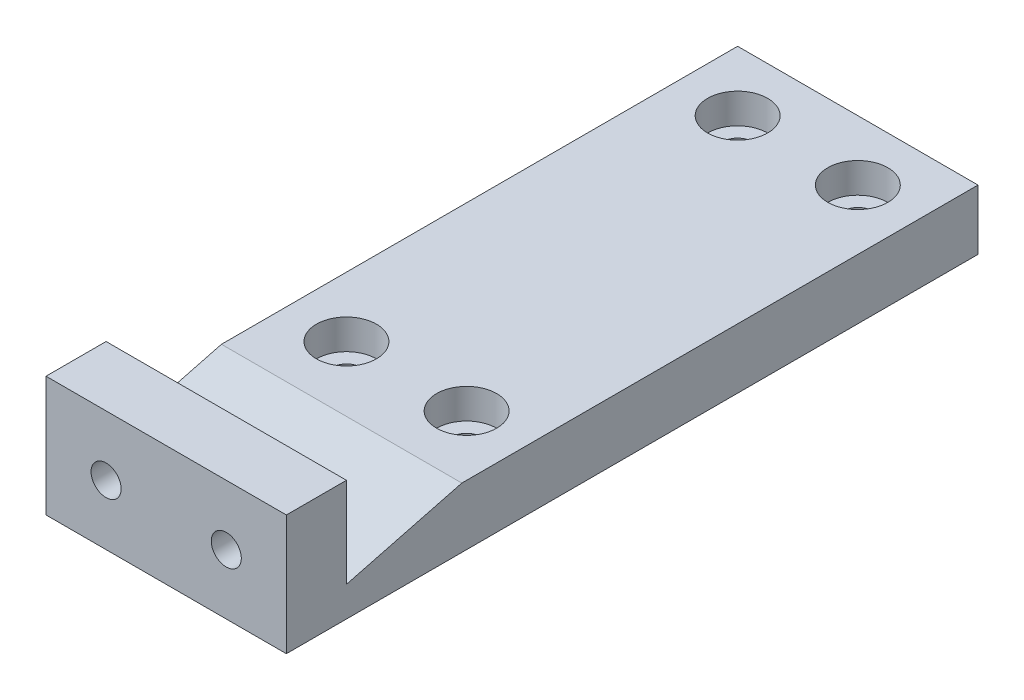
ISO-10303-21;
HEADER;
FILE_DESCRIPTION(('STEP AP214'),'2;1');
FILE_NAME('part.step','',(''),(''),'','','');
FILE_SCHEMA(('AUTOMOTIVE_DESIGN { 1 0 10303 214 1 1 1 1 }'));
ENDSEC;
DATA;
#1=APPLICATION_CONTEXT('core data for automotive mechanical design processes');
#2=APPLICATION_PROTOCOL_DEFINITION('international standard','automotive_design',2000,#1);
#3=PRODUCT_CONTEXT('',#1,'mechanical');
#4=PRODUCT('Part','Part','',(#3));
#5=PRODUCT_RELATED_PRODUCT_CATEGORY('part','',(#4));
#6=PRODUCT_DEFINITION_FORMATION('','',#4);
#7=PRODUCT_DEFINITION_CONTEXT('part definition',#1,'design');
#8=PRODUCT_DEFINITION('design','',#6,#7);
#9=PRODUCT_DEFINITION_SHAPE('','',#8);
#10=(LENGTH_UNIT() NAMED_UNIT(*) SI_UNIT(.MILLI.,.METRE.));
#11=(NAMED_UNIT(*) PLANE_ANGLE_UNIT() SI_UNIT($,.RADIAN.));
#12=(NAMED_UNIT(*) SI_UNIT($,.STERADIAN.) SOLID_ANGLE_UNIT());
#13=UNCERTAINTY_MEASURE_WITH_UNIT(LENGTH_MEASURE(1.E-05),#10,'distance_accuracy_value','');
#14=(GEOMETRIC_REPRESENTATION_CONTEXT(3) GLOBAL_UNCERTAINTY_ASSIGNED_CONTEXT((#13)) GLOBAL_UNIT_ASSIGNED_CONTEXT((#10,
#11,#12)) REPRESENTATION_CONTEXT('',''));
#15=CARTESIAN_POINT('',(0.,0.,0.));
#16=DIRECTION('',(0.,0.,1.));
#17=DIRECTION('',(1.,0.,0.));
#18=AXIS2_PLACEMENT_3D('',#15,#16,#17);
#19=CARTESIAN_POINT('',(-10.,10.,57.55));
#20=DIRECTION('',(0.,0.,-1.));
#21=DIRECTION('',(-1.,0.,0.));
#22=AXIS2_PLACEMENT_3D('',#19,#20,#21);
#23=CYLINDRICAL_SURFACE('',#22,2.5);
#24=CARTESIAN_POINT('',(-10.,10.,57.55));
#25=DIRECTION('',(0.,0.,-1.));
#26=DIRECTION('',(-1.,0.,0.));
#27=AXIS2_PLACEMENT_3D('',#24,#25,#26);
#28=CIRCLE('',#27,2.5);
#29=CARTESIAN_POINT('',(-12.5,10.,57.55));
#30=VERTEX_POINT('',#29);
#31=EDGE_CURVE('E201',#30,#30,#28,.T.);
#32=ORIENTED_EDGE('',*,*,#31,.F.);
#33=EDGE_LOOP('',(#32));
#34=FACE_BOUND('',#33,.T.);
#35=CARTESIAN_POINT('',(-10.,10.,52.55));
#36=DIRECTION('',(0.,0.,-1.));
#37=DIRECTION('',(-1.,0.,0.));
#38=AXIS2_PLACEMENT_3D('',#35,#36,#37);
#39=CIRCLE('',#38,2.5);
#40=CARTESIAN_POINT('',(-12.5,10.,52.55));
#41=VERTEX_POINT('',#40);
#42=EDGE_CURVE('E49',#41,#41,#39,.F.);
#43=ORIENTED_EDGE('',*,*,#42,.F.);
#44=EDGE_LOOP('',(#43));
#45=FACE_BOUND('',#44,.T.);
#46=ADVANCED_FACE('F45',(#34,#45),#23,.F.);
#47=CARTESIAN_POINT('',(10.,10.,57.55));
#48=DIRECTION('',(0.,0.,-1.));
#49=DIRECTION('',(-1.,0.,0.));
#50=AXIS2_PLACEMENT_3D('',#47,#48,#49);
#51=CYLINDRICAL_SURFACE('',#50,2.5);
#52=CARTESIAN_POINT('',(10.,10.,57.55));
#53=DIRECTION('',(0.,0.,-1.));
#54=DIRECTION('',(-1.,0.,0.));
#55=AXIS2_PLACEMENT_3D('',#52,#53,#54);
#56=CIRCLE('',#55,2.5);
#57=CARTESIAN_POINT('',(7.5,10.,57.55));
#58=VERTEX_POINT('',#57);
#59=EDGE_CURVE('E124',#58,#58,#56,.T.);
#60=ORIENTED_EDGE('',*,*,#59,.F.);
#61=EDGE_LOOP('',(#60));
#62=FACE_BOUND('',#61,.T.);
#63=CARTESIAN_POINT('',(10.,10.,52.55));
#64=DIRECTION('',(0.,0.,-1.));
#65=DIRECTION('',(-1.,0.,0.));
#66=AXIS2_PLACEMENT_3D('',#63,#64,#65);
#67=CIRCLE('',#66,2.5);
#68=CARTESIAN_POINT('',(7.5,10.,52.55));
#69=VERTEX_POINT('',#68);
#70=EDGE_CURVE('E192',#69,#69,#67,.F.);
#71=ORIENTED_EDGE('',*,*,#70,.F.);
#72=EDGE_LOOP('',(#71));
#73=FACE_BOUND('',#72,.T.);
#74=ADVANCED_FACE('F332',(#62,#73),#51,.F.);
#75=CARTESIAN_POINT('',(-10.,0.,-47.55));
#76=DIRECTION('',(0.,1.,0.));
#77=DIRECTION('',(0.,0.,1.));
#78=AXIS2_PLACEMENT_3D('',#75,#76,#77);
#79=CYLINDRICAL_SURFACE('',#78,2.5);
#80=CARTESIAN_POINT('',(-10.,0.,-47.55));
#81=DIRECTION('',(0.,1.,0.));
#82=DIRECTION('',(0.,0.,1.));
#83=AXIS2_PLACEMENT_3D('',#80,#81,#82);
#84=CIRCLE('',#83,2.5);
#85=CARTESIAN_POINT('',(-10.,0.,-45.05));
#86=VERTEX_POINT('',#85);
#87=EDGE_CURVE('E266',#86,#86,#84,.T.);
#88=ORIENTED_EDGE('',*,*,#87,.F.);
#89=EDGE_LOOP('',(#88));
#90=FACE_BOUND('',#89,.T.);
#91=CARTESIAN_POINT('',(-10.,5.,-47.55));
#92=DIRECTION('',(0.,1.,0.));
#93=DIRECTION('',(0.,0.,1.));
#94=AXIS2_PLACEMENT_3D('',#91,#92,#93);
#95=CIRCLE('',#94,2.5);
#96=CARTESIAN_POINT('',(-10.,5.,-45.05));
#97=VERTEX_POINT('',#96);
#98=EDGE_CURVE('E188',#97,#97,#95,.F.);
#99=ORIENTED_EDGE('',*,*,#98,.F.);
#100=EDGE_LOOP('',(#99));
#101=FACE_BOUND('',#100,.T.);
#102=ADVANCED_FACE('F338',(#90,#101),#79,.F.);
#103=CARTESIAN_POINT('',(10.,0.,-47.55));
#104=DIRECTION('',(0.,1.,0.));
#105=DIRECTION('',(0.,0.,1.));
#106=AXIS2_PLACEMENT_3D('',#103,#104,#105);
#107=CYLINDRICAL_SURFACE('',#106,2.5);
#108=CARTESIAN_POINT('',(10.,0.,-47.55));
#109=DIRECTION('',(0.,1.,0.));
#110=DIRECTION('',(0.,0.,1.));
#111=AXIS2_PLACEMENT_3D('',#108,#109,#110);
#112=CIRCLE('',#111,2.5);
#113=CARTESIAN_POINT('',(10.,0.,-45.05));
#114=VERTEX_POINT('',#113);
#115=EDGE_CURVE('E262',#114,#114,#112,.T.);
#116=ORIENTED_EDGE('',*,*,#115,.F.);
#117=EDGE_LOOP('',(#116));
#118=FACE_BOUND('',#117,.T.);
#119=CARTESIAN_POINT('',(10.,5.,-47.55));
#120=DIRECTION('',(0.,1.,0.));
#121=DIRECTION('',(0.,0.,1.));
#122=AXIS2_PLACEMENT_3D('',#119,#120,#121);
#123=CIRCLE('',#122,2.5);
#124=CARTESIAN_POINT('',(10.,5.,-45.05));
#125=VERTEX_POINT('',#124);
#126=EDGE_CURVE('E184',#125,#125,#123,.F.);
#127=ORIENTED_EDGE('',*,*,#126,.F.);
#128=EDGE_LOOP('',(#127));
#129=FACE_BOUND('',#128,.T.);
#130=ADVANCED_FACE('F379',(#118,#129),#107,.F.);
#131=CARTESIAN_POINT('',(10.,0.,17.55));
#132=DIRECTION('',(0.,1.,0.));
#133=DIRECTION('',(0.,0.,1.));
#134=AXIS2_PLACEMENT_3D('',#131,#132,#133);
#135=CYLINDRICAL_SURFACE('',#134,2.5);
#136=CARTESIAN_POINT('',(10.,0.,17.55));
#137=DIRECTION('',(0.,1.,0.));
#138=DIRECTION('',(0.,0.,1.));
#139=AXIS2_PLACEMENT_3D('',#136,#137,#138);
#140=CIRCLE('',#139,2.5);
#141=CARTESIAN_POINT('',(10.,0.,20.05));
#142=VERTEX_POINT('',#141);
#143=EDGE_CURVE('E267',#142,#142,#140,.T.);
#144=ORIENTED_EDGE('',*,*,#143,.F.);
#145=EDGE_LOOP('',(#144));
#146=FACE_BOUND('',#145,.T.);
#147=CARTESIAN_POINT('',(10.,5.,17.55));
#148=DIRECTION('',(0.,1.,0.));
#149=DIRECTION('',(0.,0.,1.));
#150=AXIS2_PLACEMENT_3D('',#147,#148,#149);
#151=CIRCLE('',#150,2.5);
#152=CARTESIAN_POINT('',(10.,5.,20.05));
#153=VERTEX_POINT('',#152);
#154=EDGE_CURVE('E179',#153,#153,#151,.F.);
#155=ORIENTED_EDGE('',*,*,#154,.F.);
#156=EDGE_LOOP('',(#155));
#157=FACE_BOUND('',#156,.T.);
#158=ADVANCED_FACE('F328',(#146,#157),#135,.F.);
#159=CARTESIAN_POINT('',(-10.,0.,17.55));
#160=DIRECTION('',(0.,1.,0.));
#161=DIRECTION('',(0.,0.,1.));
#162=AXIS2_PLACEMENT_3D('',#159,#160,#161);
#163=CYLINDRICAL_SURFACE('',#162,2.5);
#164=CARTESIAN_POINT('',(-10.,0.,17.55));
#165=DIRECTION('',(0.,1.,0.));
#166=DIRECTION('',(0.,0.,1.));
#167=AXIS2_PLACEMENT_3D('',#164,#165,#166);
#168=CIRCLE('',#167,2.5);
#169=CARTESIAN_POINT('',(-10.,0.,20.05));
#170=VERTEX_POINT('',#169);
#171=EDGE_CURVE('E191',#170,#170,#168,.T.);
#172=ORIENTED_EDGE('',*,*,#171,.F.);
#173=EDGE_LOOP('',(#172));
#174=FACE_BOUND('',#173,.T.);
#175=CARTESIAN_POINT('',(-10.,5.,17.55));
#176=DIRECTION('',(0.,1.,0.));
#177=DIRECTION('',(0.,0.,1.));
#178=AXIS2_PLACEMENT_3D('',#175,#176,#177);
#179=CIRCLE('',#178,2.5);
#180=CARTESIAN_POINT('',(-10.,5.,20.05));
#181=VERTEX_POINT('',#180);
#182=EDGE_CURVE('E175',#181,#181,#179,.F.);
#183=ORIENTED_EDGE('',*,*,#182,.F.);
#184=EDGE_LOOP('',(#183));
#185=FACE_BOUND('',#184,.T.);
#186=ADVANCED_FACE('F320',(#174,#185),#163,.F.);
#187=CARTESIAN_POINT('',(-20.,10.,57.55));
#188=DIRECTION('',(1.,0.,0.));
#189=DIRECTION('',(0.,0.,-1.));
#190=AXIS2_PLACEMENT_3D('',#187,#188,#189);
#191=PLANE('',#190);
#192=DIRECTION('',(0.,-1.,0.));
#193=VECTOR('',#192,1.);
#194=CARTESIAN_POINT('',(-20.,20.,47.55));
#195=LINE('',#194,#193);
#196=CARTESIAN_POINT('',(-20.,20.,47.55));
#197=VERTEX_POINT('',#196);
#198=CARTESIAN_POINT('',(-20.,5.,47.55));
#199=VERTEX_POINT('',#198);
#200=EDGE_CURVE('E291',#197,#199,#195,.T.);
#201=ORIENTED_EDGE('',*,*,#200,.T.);
#202=DIRECTION('',(0.,0.252011519407413,-0.967724234524468));
#203=VECTOR('',#202,1.);
#204=CARTESIAN_POINT('',(-20.,2.8787724824713,55.6955136673102));
#205=LINE('',#204,#203);
#206=CARTESIAN_POINT('',(-20.,10.,28.35));
#207=VERTEX_POINT('',#206);
#208=EDGE_CURVE('E222',#199,#207,#205,.T.);
#209=ORIENTED_EDGE('',*,*,#208,.T.);
#210=DIRECTION('',(0.,0.,1.));
#211=VECTOR('',#210,1.);
#212=CARTESIAN_POINT('',(-20.,10.,57.55));
#213=LINE('',#212,#211);
#214=CARTESIAN_POINT('',(-20.,10.,-57.55));
#215=VERTEX_POINT('',#214);
#216=EDGE_CURVE('E133',#215,#207,#213,.T.);
#217=ORIENTED_EDGE('',*,*,#216,.F.);
#218=DIRECTION('',(0.,-1.,0.));
#219=VECTOR('',#218,1.);
#220=CARTESIAN_POINT('',(-20.,10.,-57.55));
#221=LINE('',#220,#219);
#222=CARTESIAN_POINT('',(-20.,0.,-57.55));
#223=VERTEX_POINT('',#222);
#224=EDGE_CURVE('E146',#215,#223,#221,.T.);
#225=ORIENTED_EDGE('',*,*,#224,.T.);
#226=DIRECTION('',(0.,0.,1.));
#227=VECTOR('',#226,1.);
#228=CARTESIAN_POINT('',(-20.,0.,57.55));
#229=LINE('',#228,#227);
#230=CARTESIAN_POINT('',(-20.,0.,57.55));
#231=VERTEX_POINT('',#230);
#232=EDGE_CURVE('E154',#223,#231,#229,.T.);
#233=ORIENTED_EDGE('',*,*,#232,.T.);
#234=DIRECTION('',(0.,-1.,0.));
#235=VECTOR('',#234,1.);
#236=CARTESIAN_POINT('',(-20.,10.,57.55));
#237=LINE('',#236,#235);
#238=CARTESIAN_POINT('',(-20.,20.,57.55));
#239=VERTEX_POINT('',#238);
#240=EDGE_CURVE('E11',#239,#231,#237,.T.);
#241=ORIENTED_EDGE('',*,*,#240,.F.);
#242=DIRECTION('',(0.,0.,1.));
#243=VECTOR('',#242,1.);
#244=CARTESIAN_POINT('',(-20.,20.,47.55));
#245=LINE('',#244,#243);
#246=EDGE_CURVE('E277',#197,#239,#245,.T.);
#247=ORIENTED_EDGE('',*,*,#246,.F.);
#248=EDGE_LOOP('',(#201,#209,#217,#225,#233,#241,#247));
#249=FACE_BOUND('',#248,.T.);
#250=ADVANCED_FACE('F47',(#249),#191,.F.);
#251=CARTESIAN_POINT('',(20.,10.,57.55));
#252=DIRECTION('',(0.,0.,-1.));
#253=DIRECTION('',(-1.,0.,0.));
#254=AXIS2_PLACEMENT_3D('',#251,#252,#253);
#255=PLANE('',#254);
#256=ORIENTED_EDGE('',*,*,#59,.T.);
#257=EDGE_LOOP('',(#256));
#258=FACE_BOUND('',#257,.T.);
#259=ORIENTED_EDGE('',*,*,#31,.T.);
#260=EDGE_LOOP('',(#259));
#261=FACE_BOUND('',#260,.T.);
#262=DIRECTION('',(1.,0.,0.));
#263=VECTOR('',#262,1.);
#264=CARTESIAN_POINT('',(20.,0.,57.55));
#265=LINE('',#264,#263);
#266=CARTESIAN_POINT('',(20.,0.,57.55));
#267=VERTEX_POINT('',#266);
#268=EDGE_CURVE('E158',#231,#267,#265,.T.);
#269=ORIENTED_EDGE('',*,*,#268,.T.);
#270=DIRECTION('',(0.,-1.,0.));
#271=VECTOR('',#270,1.);
#272=CARTESIAN_POINT('',(20.,10.,57.55));
#273=LINE('',#272,#271);
#274=CARTESIAN_POINT('',(20.,20.,57.55));
#275=VERTEX_POINT('',#274);
#276=EDGE_CURVE('E55',#275,#267,#273,.T.);
#277=ORIENTED_EDGE('',*,*,#276,.F.);
#278=DIRECTION('',(1.,0.,0.));
#279=VECTOR('',#278,1.);
#280=CARTESIAN_POINT('',(-20.,20.,57.55));
#281=LINE('',#280,#279);
#282=EDGE_CURVE('E281',#239,#275,#281,.T.);
#283=ORIENTED_EDGE('',*,*,#282,.F.);
#284=ORIENTED_EDGE('',*,*,#240,.T.);
#285=EDGE_LOOP('',(#269,#277,#283,#284));
#286=FACE_BOUND('',#285,.T.);
#287=ADVANCED_FACE('F306',(#258,#261,#286),#255,.F.);
#288=CARTESIAN_POINT('',(20.,10.,57.55));
#289=DIRECTION('',(-1.,0.,0.));
#290=DIRECTION('',(0.,0.,1.));
#291=AXIS2_PLACEMENT_3D('',#288,#289,#290);
#292=PLANE('',#291);
#293=DIRECTION('',(0.,-0.252011519407413,0.967724234524468));
#294=VECTOR('',#293,1.);
#295=CARTESIAN_POINT('',(20.,10.,28.35));
#296=LINE('',#295,#294);
#297=CARTESIAN_POINT('',(20.,10.,28.35));
#298=VERTEX_POINT('',#297);
#299=CARTESIAN_POINT('',(20.,5.,47.55));
#300=VERTEX_POINT('',#299);
#301=EDGE_CURVE('E111',#298,#300,#296,.T.);
#302=ORIENTED_EDGE('',*,*,#301,.T.);
#303=DIRECTION('',(0.,-1.,0.));
#304=VECTOR('',#303,1.);
#305=CARTESIAN_POINT('',(20.,20.,47.55));
#306=LINE('',#305,#304);
#307=CARTESIAN_POINT('',(20.,20.,47.55));
#308=VERTEX_POINT('',#307);
#309=EDGE_CURVE('E159',#308,#300,#306,.T.);
#310=ORIENTED_EDGE('',*,*,#309,.F.);
#311=DIRECTION('',(0.,0.,-1.));
#312=VECTOR('',#311,1.);
#313=CARTESIAN_POINT('',(20.,20.,47.55));
#314=LINE('',#313,#312);
#315=EDGE_CURVE('E285',#275,#308,#314,.T.);
#316=ORIENTED_EDGE('',*,*,#315,.F.);
#317=ORIENTED_EDGE('',*,*,#276,.T.);
#318=DIRECTION('',(0.,0.,-1.));
#319=VECTOR('',#318,1.);
#320=CARTESIAN_POINT('',(20.,0.,57.55));
#321=LINE('',#320,#319);
#322=CARTESIAN_POINT('',(20.,0.,-57.55));
#323=VERTEX_POINT('',#322);
#324=EDGE_CURVE('E162',#267,#323,#321,.T.);
#325=ORIENTED_EDGE('',*,*,#324,.T.);
#326=DIRECTION('',(0.,-1.,0.));
#327=VECTOR('',#326,1.);
#328=CARTESIAN_POINT('',(20.,10.,-57.55));
#329=LINE('',#328,#327);
#330=CARTESIAN_POINT('',(20.,10.,-57.55));
#331=VERTEX_POINT('',#330);
#332=EDGE_CURVE('E139',#331,#323,#329,.T.);
#333=ORIENTED_EDGE('',*,*,#332,.F.);
#334=DIRECTION('',(0.,0.,-1.));
#335=VECTOR('',#334,1.);
#336=CARTESIAN_POINT('',(20.,10.,57.55));
#337=LINE('',#336,#335);
#338=EDGE_CURVE('E130',#298,#331,#337,.T.);
#339=ORIENTED_EDGE('',*,*,#338,.F.);
#340=EDGE_LOOP('',(#302,#310,#316,#317,#325,#333,#339));
#341=FACE_BOUND('',#340,.T.);
#342=ADVANCED_FACE('F137',(#341),#292,.F.);
#343=CARTESIAN_POINT('',(20.,10.,-57.55));
#344=DIRECTION('',(0.,0.,1.));
#345=DIRECTION('',(1.,0.,0.));
#346=AXIS2_PLACEMENT_3D('',#343,#344,#345);
#347=PLANE('',#346);
#348=DIRECTION('',(-1.,0.,0.));
#349=VECTOR('',#348,1.);
#350=CARTESIAN_POINT('',(20.,0.,-57.55));
#351=LINE('',#350,#349);
#352=EDGE_CURVE('E148',#323,#223,#351,.T.);
#353=ORIENTED_EDGE('',*,*,#352,.T.);
#354=ORIENTED_EDGE('',*,*,#224,.F.);
#355=DIRECTION('',(-1.,0.,0.));
#356=VECTOR('',#355,1.);
#357=CARTESIAN_POINT('',(20.,10.,-57.55));
#358=LINE('',#357,#356);
#359=EDGE_CURVE('E142',#331,#215,#358,.T.);
#360=ORIENTED_EDGE('',*,*,#359,.F.);
#361=ORIENTED_EDGE('',*,*,#332,.T.);
#362=EDGE_LOOP('',(#353,#354,#360,#361));
#363=FACE_BOUND('',#362,.T.);
#364=ADVANCED_FACE('F312',(#363),#347,.F.);
#365=CARTESIAN_POINT('',(0.,10.,0.));
#366=DIRECTION('',(0.,1.,0.));
#367=DIRECTION('',(0.,0.,1.));
#368=AXIS2_PLACEMENT_3D('',#365,#366,#367);
#369=PLANE('',#368);
#370=DIRECTION('',(-1.,0.,0.));
#371=VECTOR('',#370,1.);
#372=CARTESIAN_POINT('',(20.,10.,28.35));
#373=LINE('',#372,#371);
#374=EDGE_CURVE('E115',#298,#207,#373,.T.);
#375=ORIENTED_EDGE('',*,*,#374,.F.);
#376=ORIENTED_EDGE('',*,*,#338,.T.);
#377=ORIENTED_EDGE('',*,*,#359,.T.);
#378=ORIENTED_EDGE('',*,*,#216,.T.);
#379=EDGE_LOOP('',(#375,#376,#377,#378));
#380=FACE_BOUND('',#379,.T.);
#381=CARTESIAN_POINT('',(-10.,10.,-47.55));
#382=DIRECTION('',(0.,1.,0.));
#383=DIRECTION('',(0.,0.,1.));
#384=AXIS2_PLACEMENT_3D('',#381,#382,#383);
#385=CIRCLE('',#384,5.);
#386=CARTESIAN_POINT('',(-10.,10.,-42.55));
#387=VERTEX_POINT('',#386);
#388=EDGE_CURVE('E240',#387,#387,#385,.T.);
#389=ORIENTED_EDGE('',*,*,#388,.F.);
#390=EDGE_LOOP('',(#389));
#391=FACE_BOUND('',#390,.T.);
#392=CARTESIAN_POINT('',(10.,10.,17.55));
#393=DIRECTION('',(0.,1.,0.));
#394=DIRECTION('',(0.,0.,1.));
#395=AXIS2_PLACEMENT_3D('',#392,#393,#394);
#396=CIRCLE('',#395,5.);
#397=CARTESIAN_POINT('',(10.,10.,22.55));
#398=VERTEX_POINT('',#397);
#399=EDGE_CURVE('E249',#398,#398,#396,.T.);
#400=ORIENTED_EDGE('',*,*,#399,.F.);
#401=EDGE_LOOP('',(#400));
#402=FACE_BOUND('',#401,.T.);
#403=CARTESIAN_POINT('',(-10.,10.,17.55));
#404=DIRECTION('',(0.,1.,0.));
#405=DIRECTION('',(0.,0.,1.));
#406=AXIS2_PLACEMENT_3D('',#403,#404,#405);
#407=CIRCLE('',#406,5.);
#408=CARTESIAN_POINT('',(-10.,10.,22.55));
#409=VERTEX_POINT('',#408);
#410=EDGE_CURVE('E232',#409,#409,#407,.T.);
#411=ORIENTED_EDGE('',*,*,#410,.F.);
#412=EDGE_LOOP('',(#411));
#413=FACE_BOUND('',#412,.T.);
#414=CARTESIAN_POINT('',(10.,10.,-47.55));
#415=DIRECTION('',(0.,1.,0.));
#416=DIRECTION('',(0.,0.,1.));
#417=AXIS2_PLACEMENT_3D('',#414,#415,#416);
#418=CIRCLE('',#417,5.);
#419=CARTESIAN_POINT('',(10.,10.,-42.55));
#420=VERTEX_POINT('',#419);
#421=EDGE_CURVE('E244',#420,#420,#418,.T.);
#422=ORIENTED_EDGE('',*,*,#421,.F.);
#423=EDGE_LOOP('',(#422));
#424=FACE_BOUND('',#423,.T.);
#425=ADVANCED_FACE('F128',(#380,#391,#402,#413,#424),#369,.T.);
#426=CARTESIAN_POINT('',(0.,0.,0.));
#427=DIRECTION('',(0.,1.,0.));
#428=DIRECTION('',(0.,0.,1.));
#429=AXIS2_PLACEMENT_3D('',#426,#427,#428);
#430=PLANE('',#429);
#431=ORIENTED_EDGE('',*,*,#171,.T.);
#432=EDGE_LOOP('',(#431));
#433=FACE_BOUND('',#432,.T.);
#434=ORIENTED_EDGE('',*,*,#143,.T.);
#435=EDGE_LOOP('',(#434));
#436=FACE_BOUND('',#435,.T.);
#437=ORIENTED_EDGE('',*,*,#115,.T.);
#438=EDGE_LOOP('',(#437));
#439=FACE_BOUND('',#438,.T.);
#440=ORIENTED_EDGE('',*,*,#87,.T.);
#441=EDGE_LOOP('',(#440));
#442=FACE_BOUND('',#441,.T.);
#443=ORIENTED_EDGE('',*,*,#232,.F.);
#444=ORIENTED_EDGE('',*,*,#352,.F.);
#445=ORIENTED_EDGE('',*,*,#324,.F.);
#446=ORIENTED_EDGE('',*,*,#268,.F.);
#447=EDGE_LOOP('',(#443,#444,#445,#446));
#448=FACE_BOUND('',#447,.T.);
#449=ADVANCED_FACE('F309',(#433,#436,#439,#442,#448),#430,.F.);
#450=CARTESIAN_POINT('',(-20.,20.,47.55));
#451=DIRECTION('',(0.,0.,1.));
#452=DIRECTION('',(1.,0.,0.));
#453=AXIS2_PLACEMENT_3D('',#450,#451,#452);
#454=PLANE('',#453);
#455=DIRECTION('',(-1.,0.,0.));
#456=VECTOR('',#455,1.);
#457=CARTESIAN_POINT('',(20.,5.,47.55));
#458=LINE('',#457,#456);
#459=CARTESIAN_POINT('',(10.,5.,47.55));
#460=VERTEX_POINT('',#459);
#461=EDGE_CURVE('E119',#300,#460,#458,.T.);
#462=ORIENTED_EDGE('',*,*,#461,.T.);
#463=CARTESIAN_POINT('',(10.,10.,47.55));
#464=DIRECTION('',(0.,0.,-1.));
#465=DIRECTION('',(-1.,0.,0.));
#466=AXIS2_PLACEMENT_3D('',#463,#464,#465);
#467=CIRCLE('',#466,5.);
#468=EDGE_CURVE('E66',#460,#460,#467,.T.);
#469=ORIENTED_EDGE('',*,*,#468,.F.);
#470=CARTESIAN_POINT('',(-10.,5.,47.55));
#471=VERTEX_POINT('',#470);
#472=EDGE_CURVE('E223',#460,#471,#458,.T.);
#473=ORIENTED_EDGE('',*,*,#472,.T.);
#474=CARTESIAN_POINT('',(-10.,10.,47.55));
#475=DIRECTION('',(0.,0.,-1.));
#476=DIRECTION('',(-1.,0.,0.));
#477=AXIS2_PLACEMENT_3D('',#474,#475,#476);
#478=CIRCLE('',#477,5.);
#479=EDGE_CURVE('E61',#471,#471,#478,.T.);
#480=ORIENTED_EDGE('',*,*,#479,.F.);
#481=EDGE_CURVE('E135',#471,#199,#458,.T.);
#482=ORIENTED_EDGE('',*,*,#481,.T.);
#483=ORIENTED_EDGE('',*,*,#200,.F.);
#484=DIRECTION('',(-1.,0.,0.));
#485=VECTOR('',#484,1.);
#486=CARTESIAN_POINT('',(-20.,20.,47.55));
#487=LINE('',#486,#485);
#488=EDGE_CURVE('E288',#308,#197,#487,.T.);
#489=ORIENTED_EDGE('',*,*,#488,.F.);
#490=ORIENTED_EDGE('',*,*,#309,.T.);
#491=EDGE_LOOP('',(#462,#469,#473,#480,#482,#483,#489,#490));
#492=FACE_BOUND('',#491,.T.);
#493=ADVANCED_FACE('F297',(#492),#454,.F.);
#494=CARTESIAN_POINT('',(0.,20.,0.));
#495=DIRECTION('',(0.,1.,0.));
#496=DIRECTION('',(0.,0.,1.));
#497=AXIS2_PLACEMENT_3D('',#494,#495,#496);
#498=PLANE('',#497);
#499=ORIENTED_EDGE('',*,*,#246,.T.);
#500=ORIENTED_EDGE('',*,*,#282,.T.);
#501=ORIENTED_EDGE('',*,*,#315,.T.);
#502=ORIENTED_EDGE('',*,*,#488,.T.);
#503=EDGE_LOOP('',(#499,#500,#501,#502));
#504=FACE_BOUND('',#503,.T.);
#505=ADVANCED_FACE('F302',(#504),#498,.T.);
#506=CARTESIAN_POINT('',(-10.,5.,17.55));
#507=DIRECTION('',(0.,1.,0.));
#508=DIRECTION('',(0.,0.,1.));
#509=AXIS2_PLACEMENT_3D('',#506,#507,#508);
#510=PLANE('',#509);
#511=CARTESIAN_POINT('',(-10.,5.,17.55));
#512=DIRECTION('',(0.,1.,0.));
#513=DIRECTION('',(0.,0.,1.));
#514=AXIS2_PLACEMENT_3D('',#511,#512,#513);
#515=CIRCLE('',#514,5.);
#516=CARTESIAN_POINT('',(-10.,5.,22.55));
#517=VERTEX_POINT('',#516);
#518=EDGE_CURVE('E229',#517,#517,#515,.T.);
#519=ORIENTED_EDGE('',*,*,#518,.T.);
#520=EDGE_LOOP('',(#519));
#521=FACE_BOUND('',#520,.T.);
#522=ORIENTED_EDGE('',*,*,#182,.T.);
#523=EDGE_LOOP('',(#522));
#524=FACE_BOUND('',#523,.T.);
#525=ADVANCED_FACE('F353',(#521,#524),#510,.T.);
#526=CARTESIAN_POINT('',(-10.,5.,17.55));
#527=DIRECTION('',(0.,1.,0.));
#528=DIRECTION('',(0.,0.,1.));
#529=AXIS2_PLACEMENT_3D('',#526,#527,#528);
#530=CYLINDRICAL_SURFACE('',#529,5.);
#531=ORIENTED_EDGE('',*,*,#518,.F.);
#532=EDGE_LOOP('',(#531));
#533=FACE_BOUND('',#532,.T.);
#534=ORIENTED_EDGE('',*,*,#410,.T.);
#535=EDGE_LOOP('',(#534));
#536=FACE_BOUND('',#535,.T.);
#537=ADVANCED_FACE('F349',(#533,#536),#530,.F.);
#538=CARTESIAN_POINT('',(10.,5.,17.55));
#539=DIRECTION('',(0.,1.,0.));
#540=DIRECTION('',(0.,0.,1.));
#541=AXIS2_PLACEMENT_3D('',#538,#539,#540);
#542=PLANE('',#541);
#543=CARTESIAN_POINT('',(10.,5.,17.55));
#544=DIRECTION('',(0.,1.,0.));
#545=DIRECTION('',(0.,0.,1.));
#546=AXIS2_PLACEMENT_3D('',#543,#544,#545);
#547=CIRCLE('',#546,5.);
#548=CARTESIAN_POINT('',(10.,5.,22.55));
#549=VERTEX_POINT('',#548);
#550=EDGE_CURVE('E236',#549,#549,#547,.T.);
#551=ORIENTED_EDGE('',*,*,#550,.T.);
#552=EDGE_LOOP('',(#551));
#553=FACE_BOUND('',#552,.T.);
#554=ORIENTED_EDGE('',*,*,#154,.T.);
#555=EDGE_LOOP('',(#554));
#556=FACE_BOUND('',#555,.T.);
#557=ADVANCED_FACE('F352',(#553,#556),#542,.T.);
#558=CARTESIAN_POINT('',(10.,5.,17.55));
#559=DIRECTION('',(0.,1.,0.));
#560=DIRECTION('',(0.,0.,1.));
#561=AXIS2_PLACEMENT_3D('',#558,#559,#560);
#562=CYLINDRICAL_SURFACE('',#561,5.);
#563=ORIENTED_EDGE('',*,*,#550,.F.);
#564=EDGE_LOOP('',(#563));
#565=FACE_BOUND('',#564,.T.);
#566=ORIENTED_EDGE('',*,*,#399,.T.);
#567=EDGE_LOOP('',(#566));
#568=FACE_BOUND('',#567,.T.);
#569=ADVANCED_FACE('F365',(#565,#568),#562,.F.);
#570=CARTESIAN_POINT('',(10.,5.,-47.55));
#571=DIRECTION('',(0.,1.,0.));
#572=DIRECTION('',(0.,0.,1.));
#573=AXIS2_PLACEMENT_3D('',#570,#571,#572);
#574=PLANE('',#573);
#575=CARTESIAN_POINT('',(10.,5.,-47.55));
#576=DIRECTION('',(0.,1.,0.));
#577=DIRECTION('',(0.,0.,1.));
#578=AXIS2_PLACEMENT_3D('',#575,#576,#577);
#579=CIRCLE('',#578,5.);
#580=CARTESIAN_POINT('',(10.,5.,-42.55));
#581=VERTEX_POINT('',#580);
#582=EDGE_CURVE('E180',#581,#581,#579,.T.);
#583=ORIENTED_EDGE('',*,*,#582,.T.);
#584=EDGE_LOOP('',(#583));
#585=FACE_BOUND('',#584,.T.);
#586=ORIENTED_EDGE('',*,*,#126,.T.);
#587=EDGE_LOOP('',(#586));
#588=FACE_BOUND('',#587,.T.);
#589=ADVANCED_FACE('F368',(#585,#588),#574,.T.);
#590=CARTESIAN_POINT('',(10.,5.,-47.55));
#591=DIRECTION('',(0.,1.,0.));
#592=DIRECTION('',(0.,0.,1.));
#593=AXIS2_PLACEMENT_3D('',#590,#591,#592);
#594=CYLINDRICAL_SURFACE('',#593,5.);
#595=ORIENTED_EDGE('',*,*,#582,.F.);
#596=EDGE_LOOP('',(#595));
#597=FACE_BOUND('',#596,.T.);
#598=ORIENTED_EDGE('',*,*,#421,.T.);
#599=EDGE_LOOP('',(#598));
#600=FACE_BOUND('',#599,.T.);
#601=ADVANCED_FACE('F363',(#597,#600),#594,.F.);
#602=CARTESIAN_POINT('',(-10.,5.,-47.55));
#603=DIRECTION('',(0.,1.,0.));
#604=DIRECTION('',(0.,0.,1.));
#605=AXIS2_PLACEMENT_3D('',#602,#603,#604);
#606=PLANE('',#605);
#607=CARTESIAN_POINT('',(-10.,5.,-47.55));
#608=DIRECTION('',(0.,1.,0.));
#609=DIRECTION('',(0.,0.,1.));
#610=AXIS2_PLACEMENT_3D('',#607,#608,#609);
#611=CIRCLE('',#610,5.);
#612=CARTESIAN_POINT('',(-10.,5.,-42.55));
#613=VERTEX_POINT('',#612);
#614=EDGE_CURVE('E245',#613,#613,#611,.T.);
#615=ORIENTED_EDGE('',*,*,#614,.T.);
#616=EDGE_LOOP('',(#615));
#617=FACE_BOUND('',#616,.T.);
#618=ORIENTED_EDGE('',*,*,#98,.T.);
#619=EDGE_LOOP('',(#618));
#620=FACE_BOUND('',#619,.T.);
#621=ADVANCED_FACE('F359',(#617,#620),#606,.T.);
#622=CARTESIAN_POINT('',(-10.,5.,-47.55));
#623=DIRECTION('',(0.,1.,0.));
#624=DIRECTION('',(0.,0.,1.));
#625=AXIS2_PLACEMENT_3D('',#622,#623,#624);
#626=CYLINDRICAL_SURFACE('',#625,5.);
#627=ORIENTED_EDGE('',*,*,#614,.F.);
#628=EDGE_LOOP('',(#627));
#629=FACE_BOUND('',#628,.T.);
#630=ORIENTED_EDGE('',*,*,#388,.T.);
#631=EDGE_LOOP('',(#630));
#632=FACE_BOUND('',#631,.T.);
#633=ADVANCED_FACE('F348',(#629,#632),#626,.F.);
#634=CARTESIAN_POINT('',(20.,10.,28.35));
#635=DIRECTION('',(0.,-0.967724234524468,-0.252011519407413));
#636=DIRECTION('',(0.,0.252011519407413,-0.967724234524468));
#637=AXIS2_PLACEMENT_3D('',#634,#635,#636);
#638=PLANE('',#637);
#639=ORIENTED_EDGE('',*,*,#461,.F.);
#640=ORIENTED_EDGE('',*,*,#301,.F.);
#641=ORIENTED_EDGE('',*,*,#374,.T.);
#642=ORIENTED_EDGE('',*,*,#208,.F.);
#643=ORIENTED_EDGE('',*,*,#481,.F.);
#644=ORIENTED_EDGE('',*,*,#472,.F.);
#645=EDGE_LOOP('',(#639,#640,#641,#642,#643,#644));
#646=FACE_BOUND('',#645,.T.);
#647=ADVANCED_FACE('F113',(#646),#638,.F.);
#648=CARTESIAN_POINT('',(10.,10.,52.55));
#649=DIRECTION('',(0.,0.,-1.));
#650=DIRECTION('',(-1.,0.,0.));
#651=AXIS2_PLACEMENT_3D('',#648,#649,#650);
#652=PLANE('',#651);
#653=CARTESIAN_POINT('',(10.,10.,52.55));
#654=DIRECTION('',(0.,0.,-1.));
#655=DIRECTION('',(-1.,0.,0.));
#656=AXIS2_PLACEMENT_3D('',#653,#654,#655);
#657=CIRCLE('',#656,5.);
#658=CARTESIAN_POINT('',(5.,10.,52.55));
#659=VERTEX_POINT('',#658);
#660=EDGE_CURVE('E195',#659,#659,#657,.T.);
#661=ORIENTED_EDGE('',*,*,#660,.T.);
#662=EDGE_LOOP('',(#661));
#663=FACE_BOUND('',#662,.T.);
#664=ORIENTED_EDGE('',*,*,#70,.T.);
#665=EDGE_LOOP('',(#664));
#666=FACE_BOUND('',#665,.T.);
#667=ADVANCED_FACE('F347',(#663,#666),#652,.T.);
#668=CARTESIAN_POINT('',(10.,10.,52.55));
#669=DIRECTION('',(0.,0.,-1.));
#670=DIRECTION('',(-1.,0.,0.));
#671=AXIS2_PLACEMENT_3D('',#668,#669,#670);
#672=CYLINDRICAL_SURFACE('',#671,5.);
#673=ORIENTED_EDGE('',*,*,#660,.F.);
#674=EDGE_LOOP('',(#673));
#675=FACE_BOUND('',#674,.T.);
#676=ORIENTED_EDGE('',*,*,#468,.T.);
#677=EDGE_LOOP('',(#676));
#678=FACE_BOUND('',#677,.T.);
#679=ADVANCED_FACE('F520',(#675,#678),#672,.F.);
#680=CARTESIAN_POINT('',(-10.,10.,52.55));
#681=DIRECTION('',(0.,0.,-1.));
#682=DIRECTION('',(-1.,0.,0.));
#683=AXIS2_PLACEMENT_3D('',#680,#681,#682);
#684=PLANE('',#683);
#685=CARTESIAN_POINT('',(-10.,10.,52.55));
#686=DIRECTION('',(0.,0.,-1.));
#687=DIRECTION('',(-1.,0.,0.));
#688=AXIS2_PLACEMENT_3D('',#685,#686,#687);
#689=CIRCLE('',#688,5.);
#690=CARTESIAN_POINT('',(-15.,10.,52.55));
#691=VERTEX_POINT('',#690);
#692=EDGE_CURVE('E211',#691,#691,#689,.T.);
#693=ORIENTED_EDGE('',*,*,#692,.T.);
#694=EDGE_LOOP('',(#693));
#695=FACE_BOUND('',#694,.T.);
#696=ORIENTED_EDGE('',*,*,#42,.T.);
#697=EDGE_LOOP('',(#696));
#698=FACE_BOUND('',#697,.T.);
#699=ADVANCED_FACE('F529',(#695,#698),#684,.T.);
#700=CARTESIAN_POINT('',(-10.,10.,52.55));
#701=DIRECTION('',(0.,0.,-1.));
#702=DIRECTION('',(-1.,0.,0.));
#703=AXIS2_PLACEMENT_3D('',#700,#701,#702);
#704=CYLINDRICAL_SURFACE('',#703,5.);
#705=ORIENTED_EDGE('',*,*,#692,.F.);
#706=EDGE_LOOP('',(#705));
#707=FACE_BOUND('',#706,.T.);
#708=ORIENTED_EDGE('',*,*,#479,.T.);
#709=EDGE_LOOP('',(#708));
#710=FACE_BOUND('',#709,.T.);
#711=ADVANCED_FACE('F539',(#707,#710),#704,.F.);
#712=CLOSED_SHELL('',(#46,#74,#102,#130,#158,#186,#250,#287,#342,#364,#425,#449,#493,#505,#525,
#537,#557,#569,#589,#601,#621,#633,#647,#667,#679,#699,#711));
#713=MANIFOLD_SOLID_BREP('B2',#712);
#714=ADVANCED_BREP_SHAPE_REPRESENTATION('',(#18,#713),#14);
#715=SHAPE_DEFINITION_REPRESENTATION(#9,#714);
ENDSEC;
END-ISO-10303-21;
